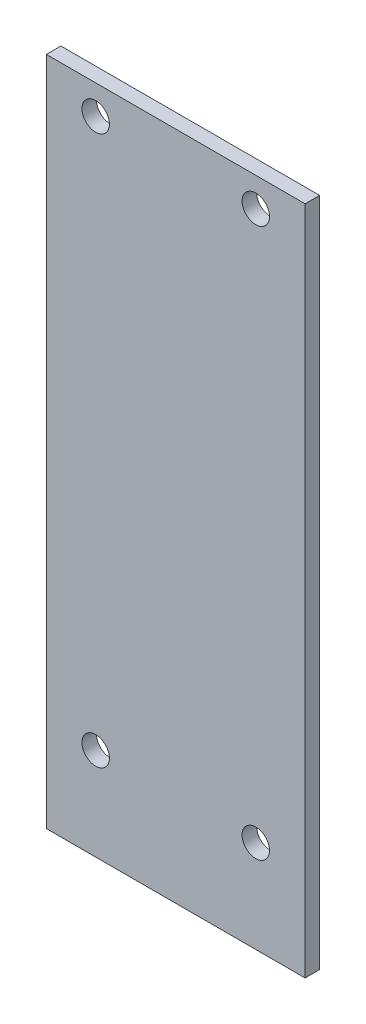
ISO-10303-21;
HEADER;
FILE_DESCRIPTION(('STEP AP214'),'2;1');
FILE_NAME('part.step','',(''),(''),'','','');
FILE_SCHEMA(('AUTOMOTIVE_DESIGN { 1 0 10303 214 1 1 1 1 }'));
ENDSEC;
DATA;
#1=APPLICATION_CONTEXT('core data for automotive mechanical design processes');
#2=APPLICATION_PROTOCOL_DEFINITION('international standard','automotive_design',2000,#1);
#3=PRODUCT_CONTEXT('',#1,'mechanical');
#4=PRODUCT('Part','Part','',(#3));
#5=PRODUCT_RELATED_PRODUCT_CATEGORY('part','',(#4));
#6=PRODUCT_DEFINITION_FORMATION('','',#4);
#7=PRODUCT_DEFINITION_CONTEXT('part definition',#1,'design');
#8=PRODUCT_DEFINITION('design','',#6,#7);
#9=PRODUCT_DEFINITION_SHAPE('','',#8);
#10=(LENGTH_UNIT() NAMED_UNIT(*) SI_UNIT(.MILLI.,.METRE.));
#11=(NAMED_UNIT(*) PLANE_ANGLE_UNIT() SI_UNIT($,.RADIAN.));
#12=(NAMED_UNIT(*) SI_UNIT($,.STERADIAN.) SOLID_ANGLE_UNIT());
#13=UNCERTAINTY_MEASURE_WITH_UNIT(LENGTH_MEASURE(1.E-05),#10,'distance_accuracy_value','');
#14=(GEOMETRIC_REPRESENTATION_CONTEXT(3) GLOBAL_UNCERTAINTY_ASSIGNED_CONTEXT((#13)) GLOBAL_UNIT_ASSIGNED_CONTEXT((#10,
#11,#12)) REPRESENTATION_CONTEXT('',''));
#15=CARTESIAN_POINT('',(0.,0.,0.));
#16=DIRECTION('',(0.,0.,1.));
#17=DIRECTION('',(1.,0.,0.));
#18=AXIS2_PLACEMENT_3D('',#15,#16,#17);
#19=CARTESIAN_POINT('',(28.275,73.275,3.175));
#20=DIRECTION('',(-1.,0.,0.));
#21=DIRECTION('',(0.,-1.,0.));
#22=AXIS2_PLACEMENT_3D('',#19,#20,#21);
#23=PLANE('',#22);
#24=DIRECTION('',(0.,1.,0.));
#25=VECTOR('',#24,1.);
#26=CARTESIAN_POINT('',(28.275,73.275,0.));
#27=LINE('',#26,#25);
#28=CARTESIAN_POINT('',(28.275,-73.275,0.));
#29=VERTEX_POINT('',#28);
#30=CARTESIAN_POINT('',(28.275,73.275,0.));
#31=VERTEX_POINT('',#30);
#32=EDGE_CURVE('E101',#29,#31,#27,.T.);
#33=ORIENTED_EDGE('',*,*,#32,.T.);
#34=DIRECTION('',(0.,0.,-1.));
#35=VECTOR('',#34,1.);
#36=CARTESIAN_POINT('',(28.275,73.275,3.175));
#37=LINE('',#36,#35);
#38=CARTESIAN_POINT('',(28.275,73.275,3.175));
#39=VERTEX_POINT('',#38);
#40=EDGE_CURVE('E11',#39,#31,#37,.T.);
#41=ORIENTED_EDGE('',*,*,#40,.F.);
#42=DIRECTION('',(0.,1.,0.));
#43=VECTOR('',#42,1.);
#44=CARTESIAN_POINT('',(28.275,73.275,3.175));
#45=LINE('',#44,#43);
#46=CARTESIAN_POINT('',(28.275,-73.275,3.175));
#47=VERTEX_POINT('',#46);
#48=EDGE_CURVE('E89',#47,#39,#45,.T.);
#49=ORIENTED_EDGE('',*,*,#48,.F.);
#50=DIRECTION('',(0.,0.,-1.));
#51=VECTOR('',#50,1.);
#52=CARTESIAN_POINT('',(28.275,-73.275,3.175));
#53=LINE('',#52,#51);
#54=EDGE_CURVE('E97',#47,#29,#53,.T.);
#55=ORIENTED_EDGE('',*,*,#54,.T.);
#56=EDGE_LOOP('',(#33,#41,#49,#55));
#57=FACE_BOUND('',#56,.T.);
#58=ADVANCED_FACE('F38',(#57),#23,.F.);
#59=CARTESIAN_POINT('',(-28.275,73.275,3.175));
#60=DIRECTION('',(0.,-1.,0.));
#61=DIRECTION('',(0.,0.,-1.));
#62=AXIS2_PLACEMENT_3D('',#59,#60,#61);
#63=PLANE('',#62);
#64=DIRECTION('',(-1.,0.,0.));
#65=VECTOR('',#64,1.);
#66=CARTESIAN_POINT('',(-28.275,73.275,0.));
#67=LINE('',#66,#65);
#68=CARTESIAN_POINT('',(-28.275,73.275,0.));
#69=VERTEX_POINT('',#68);
#70=EDGE_CURVE('E93',#31,#69,#67,.T.);
#71=ORIENTED_EDGE('',*,*,#70,.T.);
#72=DIRECTION('',(0.,0.,-1.));
#73=VECTOR('',#72,1.);
#74=CARTESIAN_POINT('',(-28.275,73.275,3.175));
#75=LINE('',#74,#73);
#76=CARTESIAN_POINT('',(-28.275,73.275,3.175));
#77=VERTEX_POINT('',#76);
#78=EDGE_CURVE('E46',#77,#69,#75,.T.);
#79=ORIENTED_EDGE('',*,*,#78,.F.);
#80=DIRECTION('',(-1.,0.,0.));
#81=VECTOR('',#80,1.);
#82=CARTESIAN_POINT('',(-28.275,73.275,3.175));
#83=LINE('',#82,#81);
#84=EDGE_CURVE('E84',#39,#77,#83,.T.);
#85=ORIENTED_EDGE('',*,*,#84,.F.);
#86=ORIENTED_EDGE('',*,*,#40,.T.);
#87=EDGE_LOOP('',(#71,#79,#85,#86));
#88=FACE_BOUND('',#87,.T.);
#89=ADVANCED_FACE('F92',(#88),#63,.F.);
#90=CARTESIAN_POINT('',(-28.275,73.275,3.175));
#91=DIRECTION('',(1.,0.,0.));
#92=DIRECTION('',(0.,1.,0.));
#93=AXIS2_PLACEMENT_3D('',#90,#91,#92);
#94=PLANE('',#93);
#95=DIRECTION('',(0.,-1.,0.));
#96=VECTOR('',#95,1.);
#97=CARTESIAN_POINT('',(-28.275,73.275,0.));
#98=LINE('',#97,#96);
#99=CARTESIAN_POINT('',(-28.275,-73.275,0.));
#100=VERTEX_POINT('',#99);
#101=EDGE_CURVE('E71',#69,#100,#98,.T.);
#102=ORIENTED_EDGE('',*,*,#101,.T.);
#103=DIRECTION('',(0.,0.,-1.));
#104=VECTOR('',#103,1.);
#105=CARTESIAN_POINT('',(-28.275,-73.275,3.175));
#106=LINE('',#105,#104);
#107=CARTESIAN_POINT('',(-28.275,-73.275,3.175));
#108=VERTEX_POINT('',#107);
#109=EDGE_CURVE('E94',#108,#100,#106,.T.);
#110=ORIENTED_EDGE('',*,*,#109,.F.);
#111=DIRECTION('',(0.,-1.,0.));
#112=VECTOR('',#111,1.);
#113=CARTESIAN_POINT('',(-28.275,73.275,3.175));
#114=LINE('',#113,#112);
#115=EDGE_CURVE('E87',#77,#108,#114,.T.);
#116=ORIENTED_EDGE('',*,*,#115,.F.);
#117=ORIENTED_EDGE('',*,*,#78,.T.);
#118=EDGE_LOOP('',(#102,#110,#116,#117));
#119=FACE_BOUND('',#118,.T.);
#120=ADVANCED_FACE('F95',(#119),#94,.F.);
#121=CARTESIAN_POINT('',(-28.275,-73.275,3.175));
#122=DIRECTION('',(0.,1.,0.));
#123=DIRECTION('',(0.,0.,1.));
#124=AXIS2_PLACEMENT_3D('',#121,#122,#123);
#125=PLANE('',#124);
#126=DIRECTION('',(1.,0.,0.));
#127=VECTOR('',#126,1.);
#128=CARTESIAN_POINT('',(-28.275,-73.275,0.));
#129=LINE('',#128,#127);
#130=EDGE_CURVE('E77',#100,#29,#129,.T.);
#131=ORIENTED_EDGE('',*,*,#130,.T.);
#132=ORIENTED_EDGE('',*,*,#54,.F.);
#133=DIRECTION('',(1.,0.,0.));
#134=VECTOR('',#133,1.);
#135=CARTESIAN_POINT('',(-28.275,-73.275,3.175));
#136=LINE('',#135,#134);
#137=EDGE_CURVE('E54',#108,#47,#136,.T.);
#138=ORIENTED_EDGE('',*,*,#137,.F.);
#139=ORIENTED_EDGE('',*,*,#109,.T.);
#140=EDGE_LOOP('',(#131,#132,#138,#139));
#141=FACE_BOUND('',#140,.T.);
#142=ADVANCED_FACE('F109',(#141),#125,.F.);
#143=CARTESIAN_POINT('',(0.,0.,3.175));
#144=DIRECTION('',(0.,0.,1.));
#145=DIRECTION('',(1.,0.,0.));
#146=AXIS2_PLACEMENT_3D('',#143,#144,#145);
#147=PLANE('',#146);
#148=CARTESIAN_POINT('',(17.5000000000009,66.9249999999985,3.175));
#149=DIRECTION('',(0.,0.,1.));
#150=DIRECTION('',(1.,0.,0.));
#151=AXIS2_PLACEMENT_3D('',#148,#149,#150);
#152=CIRCLE('',#151,3.);
#153=CARTESIAN_POINT('',(20.5000000000009,66.9249999999985,3.175));
#154=VERTEX_POINT('',#153);
#155=EDGE_CURVE('E124',#154,#154,#152,.T.);
#156=ORIENTED_EDGE('',*,*,#155,.F.);
#157=EDGE_LOOP('',(#156));
#158=FACE_BOUND('',#157,.T.);
#159=CARTESIAN_POINT('',(-17.4999999999991,66.9249999999985,3.175));
#160=DIRECTION('',(0.,0.,1.));
#161=DIRECTION('',(1.,0.,0.));
#162=AXIS2_PLACEMENT_3D('',#159,#160,#161);
#163=CIRCLE('',#162,3.);
#164=CARTESIAN_POINT('',(-14.4999999999991,66.9249999999985,3.175));
#165=VERTEX_POINT('',#164);
#166=EDGE_CURVE('E130',#165,#165,#163,.T.);
#167=ORIENTED_EDGE('',*,*,#166,.F.);
#168=EDGE_LOOP('',(#167));
#169=FACE_BOUND('',#168,.T.);
#170=CARTESIAN_POINT('',(-17.4999999999991,-53.0750000000015,3.175));
#171=DIRECTION('',(0.,0.,1.));
#172=DIRECTION('',(1.,0.,0.));
#173=AXIS2_PLACEMENT_3D('',#170,#171,#172);
#174=CIRCLE('',#173,3.);
#175=CARTESIAN_POINT('',(-14.4999999999991,-53.0750000000015,3.175));
#176=VERTEX_POINT('',#175);
#177=EDGE_CURVE('E118',#176,#176,#174,.T.);
#178=ORIENTED_EDGE('',*,*,#177,.F.);
#179=EDGE_LOOP('',(#178));
#180=FACE_BOUND('',#179,.T.);
#181=CARTESIAN_POINT('',(17.5000000000009,-53.0750000000015,3.175));
#182=DIRECTION('',(0.,0.,1.));
#183=DIRECTION('',(1.,0.,0.));
#184=AXIS2_PLACEMENT_3D('',#181,#182,#183);
#185=CIRCLE('',#184,3.);
#186=CARTESIAN_POINT('',(20.5000000000009,-53.0750000000015,3.175));
#187=VERTEX_POINT('',#186);
#188=EDGE_CURVE('E115',#187,#187,#185,.T.);
#189=ORIENTED_EDGE('',*,*,#188,.F.);
#190=EDGE_LOOP('',(#189));
#191=FACE_BOUND('',#190,.T.);
#192=ORIENTED_EDGE('',*,*,#48,.T.);
#193=ORIENTED_EDGE('',*,*,#84,.T.);
#194=ORIENTED_EDGE('',*,*,#115,.T.);
#195=ORIENTED_EDGE('',*,*,#137,.T.);
#196=EDGE_LOOP('',(#192,#193,#194,#195));
#197=FACE_BOUND('',#196,.T.);
#198=ADVANCED_FACE('F85',(#158,#169,#180,#191,#197),#147,.T.);
#199=CARTESIAN_POINT('',(0.,0.,0.));
#200=DIRECTION('',(0.,0.,1.));
#201=DIRECTION('',(1.,0.,0.));
#202=AXIS2_PLACEMENT_3D('',#199,#200,#201);
#203=PLANE('',#202);
#204=CARTESIAN_POINT('',(17.5000000000009,66.9249999999985,0.));
#205=DIRECTION('',(0.,0.,1.));
#206=DIRECTION('',(1.,0.,0.));
#207=AXIS2_PLACEMENT_3D('',#204,#205,#206);
#208=CIRCLE('',#207,3.);
#209=CARTESIAN_POINT('',(20.5000000000009,66.9249999999985,0.));
#210=VERTEX_POINT('',#209);
#211=EDGE_CURVE('E121',#210,#210,#208,.T.);
#212=ORIENTED_EDGE('',*,*,#211,.T.);
#213=EDGE_LOOP('',(#212));
#214=FACE_BOUND('',#213,.T.);
#215=CARTESIAN_POINT('',(-17.4999999999991,66.9249999999985,0.));
#216=DIRECTION('',(0.,0.,1.));
#217=DIRECTION('',(1.,0.,0.));
#218=AXIS2_PLACEMENT_3D('',#215,#216,#217);
#219=CIRCLE('',#218,3.);
#220=CARTESIAN_POINT('',(-14.4999999999991,66.9249999999985,0.));
#221=VERTEX_POINT('',#220);
#222=EDGE_CURVE('E127',#221,#221,#219,.T.);
#223=ORIENTED_EDGE('',*,*,#222,.T.);
#224=EDGE_LOOP('',(#223));
#225=FACE_BOUND('',#224,.T.);
#226=CARTESIAN_POINT('',(-17.4999999999991,-53.0750000000015,0.));
#227=DIRECTION('',(0.,0.,1.));
#228=DIRECTION('',(1.,0.,0.));
#229=AXIS2_PLACEMENT_3D('',#226,#227,#228);
#230=CIRCLE('',#229,3.);
#231=CARTESIAN_POINT('',(-14.4999999999991,-53.0750000000015,0.));
#232=VERTEX_POINT('',#231);
#233=EDGE_CURVE('E133',#232,#232,#230,.T.);
#234=ORIENTED_EDGE('',*,*,#233,.T.);
#235=EDGE_LOOP('',(#234));
#236=FACE_BOUND('',#235,.T.);
#237=CARTESIAN_POINT('',(17.5000000000009,-53.0750000000015,0.));
#238=DIRECTION('',(0.,0.,1.));
#239=DIRECTION('',(1.,0.,0.));
#240=AXIS2_PLACEMENT_3D('',#237,#238,#239);
#241=CIRCLE('',#240,3.);
#242=CARTESIAN_POINT('',(20.5000000000009,-53.0750000000015,0.));
#243=VERTEX_POINT('',#242);
#244=EDGE_CURVE('E104',#243,#243,#241,.T.);
#245=ORIENTED_EDGE('',*,*,#244,.T.);
#246=EDGE_LOOP('',(#245));
#247=FACE_BOUND('',#246,.T.);
#248=ORIENTED_EDGE('',*,*,#32,.F.);
#249=ORIENTED_EDGE('',*,*,#130,.F.);
#250=ORIENTED_EDGE('',*,*,#101,.F.);
#251=ORIENTED_EDGE('',*,*,#70,.F.);
#252=EDGE_LOOP('',(#248,#249,#250,#251));
#253=FACE_BOUND('',#252,.T.);
#254=ADVANCED_FACE('F112',(#214,#225,#236,#247,#253),#203,.F.);
#255=CARTESIAN_POINT('',(17.5000000000009,-53.0750000000015,0.));
#256=DIRECTION('',(0.,0.,1.));
#257=DIRECTION('',(1.,0.,0.));
#258=AXIS2_PLACEMENT_3D('',#255,#256,#257);
#259=CYLINDRICAL_SURFACE('',#258,3.);
#260=ORIENTED_EDGE('',*,*,#244,.F.);
#261=EDGE_LOOP('',(#260));
#262=FACE_BOUND('',#261,.T.);
#263=ORIENTED_EDGE('',*,*,#188,.T.);
#264=EDGE_LOOP('',(#263));
#265=FACE_BOUND('',#264,.T.);
#266=ADVANCED_FACE('F147',(#262,#265),#259,.F.);
#267=CARTESIAN_POINT('',(-17.4999999999991,-53.0750000000015,0.));
#268=DIRECTION('',(0.,0.,1.));
#269=DIRECTION('',(1.,0.,0.));
#270=AXIS2_PLACEMENT_3D('',#267,#268,#269);
#271=CYLINDRICAL_SURFACE('',#270,3.);
#272=ORIENTED_EDGE('',*,*,#233,.F.);
#273=EDGE_LOOP('',(#272));
#274=FACE_BOUND('',#273,.T.);
#275=ORIENTED_EDGE('',*,*,#177,.T.);
#276=EDGE_LOOP('',(#275));
#277=FACE_BOUND('',#276,.T.);
#278=ADVANCED_FACE('F139',(#274,#277),#271,.F.);
#279=CARTESIAN_POINT('',(-17.4999999999991,66.9249999999985,0.));
#280=DIRECTION('',(0.,0.,1.));
#281=DIRECTION('',(1.,0.,0.));
#282=AXIS2_PLACEMENT_3D('',#279,#280,#281);
#283=CYLINDRICAL_SURFACE('',#282,3.);
#284=ORIENTED_EDGE('',*,*,#222,.F.);
#285=EDGE_LOOP('',(#284));
#286=FACE_BOUND('',#285,.T.);
#287=ORIENTED_EDGE('',*,*,#166,.T.);
#288=EDGE_LOOP('',(#287));
#289=FACE_BOUND('',#288,.T.);
#290=ADVANCED_FACE('F155',(#286,#289),#283,.F.);
#291=CARTESIAN_POINT('',(17.5000000000009,66.9249999999985,0.));
#292=DIRECTION('',(0.,0.,1.));
#293=DIRECTION('',(1.,0.,0.));
#294=AXIS2_PLACEMENT_3D('',#291,#292,#293);
#295=CYLINDRICAL_SURFACE('',#294,3.);
#296=ORIENTED_EDGE('',*,*,#211,.F.);
#297=EDGE_LOOP('',(#296));
#298=FACE_BOUND('',#297,.T.);
#299=ORIENTED_EDGE('',*,*,#155,.T.);
#300=EDGE_LOOP('',(#299));
#301=FACE_BOUND('',#300,.T.);
#302=ADVANCED_FACE('F209',(#298,#301),#295,.F.);
#303=CLOSED_SHELL('',(#58,#89,#120,#142,#198,#254,#266,#278,#290,#302));
#304=MANIFOLD_SOLID_BREP('B2',#303);
#305=ADVANCED_BREP_SHAPE_REPRESENTATION('',(#18,#304),#14);
#306=SHAPE_DEFINITION_REPRESENTATION(#9,#305);
ENDSEC;
END-ISO-10303-21;
